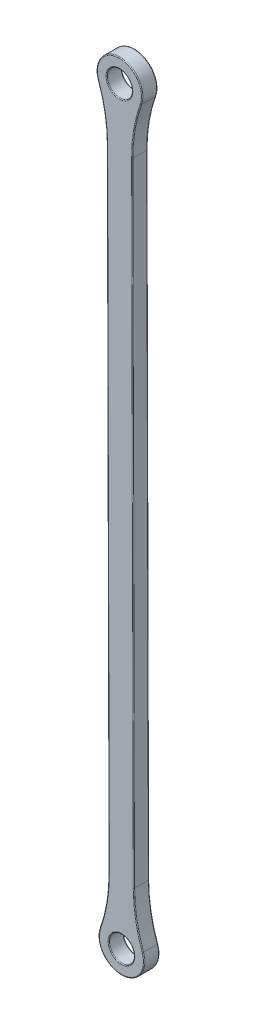
ISO-10303-21;
HEADER;
FILE_DESCRIPTION(('STEP AP214'),'2;1');
FILE_NAME('part.step','',(''),(''),'','','');
FILE_SCHEMA(('AUTOMOTIVE_DESIGN { 1 0 10303 214 1 1 1 1 }'));
ENDSEC;
DATA;
#1=APPLICATION_CONTEXT('core data for automotive mechanical design processes');
#2=APPLICATION_PROTOCOL_DEFINITION('international standard','automotive_design',2000,#1);
#3=PRODUCT_CONTEXT('',#1,'mechanical');
#4=PRODUCT('Part','Part','',(#3));
#5=PRODUCT_RELATED_PRODUCT_CATEGORY('part','',(#4));
#6=PRODUCT_DEFINITION_FORMATION('','',#4);
#7=PRODUCT_DEFINITION_CONTEXT('part definition',#1,'design');
#8=PRODUCT_DEFINITION('design','',#6,#7);
#9=PRODUCT_DEFINITION_SHAPE('','',#8);
#10=(LENGTH_UNIT() NAMED_UNIT(*) SI_UNIT(.MILLI.,.METRE.));
#11=(NAMED_UNIT(*) PLANE_ANGLE_UNIT() SI_UNIT($,.RADIAN.));
#12=(NAMED_UNIT(*) SI_UNIT($,.STERADIAN.) SOLID_ANGLE_UNIT());
#13=UNCERTAINTY_MEASURE_WITH_UNIT(LENGTH_MEASURE(1.E-05),#10,'distance_accuracy_value','');
#14=(GEOMETRIC_REPRESENTATION_CONTEXT(3) GLOBAL_UNCERTAINTY_ASSIGNED_CONTEXT((#13)) GLOBAL_UNIT_ASSIGNED_CONTEXT((#10,
#11,#12)) REPRESENTATION_CONTEXT('',''));
#15=CARTESIAN_POINT('',(0.,0.,0.));
#16=DIRECTION('',(0.,0.,1.));
#17=DIRECTION('',(1.,0.,0.));
#18=AXIS2_PLACEMENT_3D('',#15,#16,#17);
#19=CARTESIAN_POINT('',(12.2160366801793,0.0323959398691062,-3.));
#20=DIRECTION('',(0.999996483681336,0.00265190968255857,0.));
#21=DIRECTION('',(-0.00265190968255857,0.999996483681336,0.));
#22=AXIS2_PLACEMENT_3D('',#19,#20,#21);
#23=PLANE('',#22);
#24=DIRECTION('',(0.,0.,1.));
#25=VECTOR('',#24,1.);
#26=CARTESIAN_POINT('',(11.9693107001592,93.0691664134846,-3.));
#27=LINE('',#26,#25);
#28=CARTESIAN_POINT('',(11.9693107001592,93.0691664134846,-2.85));
#29=VERTEX_POINT('',#28);
#30=CARTESIAN_POINT('',(11.9693107001592,93.0691664134846,-0.15));
#31=VERTEX_POINT('',#30);
#32=EDGE_CURVE('E307',#29,#31,#27,.T.);
#33=ORIENTED_EDGE('',*,*,#32,.T.);
#34=DIRECTION('',(-0.00265190968255857,0.999996483681336,0.));
#35=VECTOR('',#34,1.);
#36=CARTESIAN_POINT('',(11.638224215073,217.917053601405,-0.15));
#37=LINE('',#36,#35);
#38=CARTESIAN_POINT('',(11.638224215073,217.917053601405,-0.15));
#39=VERTEX_POINT('',#38);
#40=EDGE_CURVE('E230',#31,#39,#37,.T.);
#41=ORIENTED_EDGE('',*,*,#40,.T.);
#42=DIRECTION('',(0.,0.,1.));
#43=VECTOR('',#42,1.);
#44=CARTESIAN_POINT('',(11.638224215073,217.917053601405,-3.));
#45=LINE('',#44,#43);
#46=CARTESIAN_POINT('',(11.638224215073,217.917053601405,-2.85));
#47=VERTEX_POINT('',#46);
#48=EDGE_CURVE('E302',#39,#47,#45,.F.);
#49=ORIENTED_EDGE('',*,*,#48,.T.);
#50=DIRECTION('',(-0.00265190968255857,0.999996483681336,0.));
#51=VECTOR('',#50,1.);
#52=CARTESIAN_POINT('',(12.2160366801793,0.0323959398691062,-2.85));
#53=LINE('',#52,#51);
#54=EDGE_CURVE('E228',#47,#29,#53,.F.);
#55=ORIENTED_EDGE('',*,*,#54,.T.);
#56=EDGE_LOOP('',(#33,#41,#49,#55));
#57=FACE_BOUND('',#56,.T.);
#58=ADVANCED_FACE('F36',(#57),#23,.F.);
#59=CARTESIAN_POINT('',(14.1075173503101,229.49947957407,-3.));
#60=DIRECTION('',(0.,0.,1.));
#61=DIRECTION('',(1.,0.,0.));
#62=AXIS2_PLACEMENT_3D('',#59,#60,#61);
#63=CYLINDRICAL_SURFACE('',#62,4.50000000000001);
#64=DIRECTION('',(0.,0.,1.));
#65=VECTOR('',#64,1.);
#66=CARTESIAN_POINT('',(9.87240591826523,227.978351322356,-3.));
#67=LINE('',#66,#65);
#68=CARTESIAN_POINT('',(9.87240591826523,227.978351322356,-2.85));
#69=VERTEX_POINT('',#68);
#70=CARTESIAN_POINT('',(9.87240591826523,227.978351322356,-0.15));
#71=VERTEX_POINT('',#70);
#72=EDGE_CURVE('E171',#69,#71,#67,.T.);
#73=ORIENTED_EDGE('',*,*,#72,.T.);
#74=CARTESIAN_POINT('',(14.1075173503101,229.49947957407,-0.15));
#75=DIRECTION('',(0.,0.,1.));
#76=DIRECTION('',(1.,0.,0.));
#77=AXIS2_PLACEMENT_3D('',#74,#75,#76);
#78=CIRCLE('',#77,4.50000000000001);
#79=CARTESIAN_POINT('',(18.3506369755635,228.000834904447,-0.15));
#80=VERTEX_POINT('',#79);
#81=EDGE_CURVE('E205',#71,#80,#78,.F.);
#82=ORIENTED_EDGE('',*,*,#81,.T.);
#83=DIRECTION('',(0.,0.,1.));
#84=VECTOR('',#83,1.);
#85=CARTESIAN_POINT('',(18.3506369755635,228.000834904447,-3.));
#86=LINE('',#85,#84);
#87=CARTESIAN_POINT('',(18.3506369755635,228.000834904447,-2.85));
#88=VERTEX_POINT('',#87);
#89=EDGE_CURVE('E310',#80,#88,#86,.F.);
#90=ORIENTED_EDGE('',*,*,#89,.T.);
#91=CARTESIAN_POINT('',(14.1075173503101,229.49947957407,-2.85));
#92=DIRECTION('',(0.,0.,1.));
#93=DIRECTION('',(1.,0.,0.));
#94=AXIS2_PLACEMENT_3D('',#91,#92,#93);
#95=CIRCLE('',#94,4.50000000000001);
#96=EDGE_CURVE('E203',#88,#69,#95,.T.);
#97=ORIENTED_EDGE('',*,*,#96,.T.);
#98=EDGE_LOOP('',(#73,#82,#90,#97));
#99=FACE_BOUND('',#98,.T.);
#100=ADVANCED_FACE('F338',(#99),#63,.T.);
#101=CARTESIAN_POINT('',(17.216019098586,0.0456554882818991,-3.));
#102=DIRECTION('',(0.999996483681336,0.00265190968255857,0.));
#103=DIRECTION('',(-0.00265190968255857,0.999996483681336,0.));
#104=AXIS2_PLACEMENT_3D('',#101,#102,#103);
#105=PLANE('',#104);
#106=DIRECTION('',(0.,0.,-1.));
#107=VECTOR('',#106,1.);
#108=CARTESIAN_POINT('',(16.6382066334797,217.930313149817,0.));
#109=LINE('',#108,#107);
#110=CARTESIAN_POINT('',(16.6382066334797,217.930313149817,-2.85));
#111=VERTEX_POINT('',#110);
#112=CARTESIAN_POINT('',(16.6382066334797,217.930313149817,-0.15));
#113=VERTEX_POINT('',#112);
#114=EDGE_CURVE('E313',#111,#113,#109,.F.);
#115=ORIENTED_EDGE('',*,*,#114,.T.);
#116=DIRECTION('',(-0.00265190968255857,0.999996483681336,0.));
#117=VECTOR('',#116,1.);
#118=CARTESIAN_POINT('',(17.216019098586,0.0456554882818991,-0.15));
#119=LINE('',#118,#117);
#120=CARTESIAN_POINT('',(16.9692931185659,93.0824259618973,-0.15));
#121=VERTEX_POINT('',#120);
#122=EDGE_CURVE('E213',#113,#121,#119,.F.);
#123=ORIENTED_EDGE('',*,*,#122,.T.);
#124=DIRECTION('',(0.,0.,-1.));
#125=VECTOR('',#124,1.);
#126=CARTESIAN_POINT('',(16.9692931185659,93.0824259618973,-3.));
#127=LINE('',#126,#125);
#128=CARTESIAN_POINT('',(16.9692931185659,93.0824259618973,-2.85));
#129=VERTEX_POINT('',#128);
#130=EDGE_CURVE('E308',#121,#129,#127,.T.);
#131=ORIENTED_EDGE('',*,*,#130,.T.);
#132=DIRECTION('',(-0.00265190968255857,0.999996483681336,0.));
#133=VECTOR('',#132,1.);
#134=CARTESIAN_POINT('',(16.6382066334797,217.930313149817,-2.85));
#135=LINE('',#134,#133);
#136=EDGE_CURVE('E211',#129,#111,#135,.T.);
#137=ORIENTED_EDGE('',*,*,#136,.T.);
#138=EDGE_LOOP('',(#115,#123,#131,#137));
#139=FACE_BOUND('',#138,.T.);
#140=ADVANCED_FACE('F381',(#139),#105,.T.);
#141=CARTESIAN_POINT('',(14.1075173503101,229.49947957407,-3.));
#142=DIRECTION('',(0.,0.,1.));
#143=DIRECTION('',(1.,0.,0.));
#144=AXIS2_PLACEMENT_3D('',#141,#142,#143);
#145=CYLINDRICAL_SURFACE('',#144,2.50000000000001);
#146=CARTESIAN_POINT('',(14.1075173503101,229.49947957407,-0.15));
#147=DIRECTION('',(0.,0.,1.));
#148=DIRECTION('',(1.,0.,0.));
#149=AXIS2_PLACEMENT_3D('',#146,#147,#148);
#150=CIRCLE('',#149,2.50000000000001);
#151=CARTESIAN_POINT('',(16.6075173503101,229.49947957407,-0.15));
#152=VERTEX_POINT('',#151);
#153=EDGE_CURVE('E197',#152,#152,#150,.T.);
#154=ORIENTED_EDGE('',*,*,#153,.T.);
#155=EDGE_LOOP('',(#154));
#156=FACE_BOUND('',#155,.T.);
#157=CARTESIAN_POINT('',(14.1075173503101,229.49947957407,-2.85));
#158=DIRECTION('',(0.,0.,1.));
#159=DIRECTION('',(1.,0.,0.));
#160=AXIS2_PLACEMENT_3D('',#157,#158,#159);
#161=CIRCLE('',#160,2.50000000000001);
#162=CARTESIAN_POINT('',(16.6075173503101,229.49947957407,-2.85));
#163=VERTEX_POINT('',#162);
#164=EDGE_CURVE('E194',#163,#163,#161,.F.);
#165=ORIENTED_EDGE('',*,*,#164,.T.);
#166=EDGE_LOOP('',(#165));
#167=FACE_BOUND('',#166,.T.);
#168=ADVANCED_FACE('F628',(#156,#167),#145,.F.);
#169=CARTESIAN_POINT('',(14.4999999833287,81.4999999892321,-3.));
#170=DIRECTION('',(0.,0.,1.));
#171=DIRECTION('',(1.,0.,0.));
#172=AXIS2_PLACEMENT_3D('',#169,#170,#171);
#173=CYLINDRICAL_SURFACE('',#172,4.5);
#174=DIRECTION('',(0.,0.,1.));
#175=VECTOR('',#174,1.);
#176=CARTESIAN_POINT('',(18.7351114153736,83.0211282409463,-3.));
#177=LINE('',#176,#175);
#178=CARTESIAN_POINT('',(18.7351114153736,83.0211282409463,-2.85));
#179=VERTEX_POINT('',#178);
#180=CARTESIAN_POINT('',(18.7351114153736,83.0211282409463,-0.15));
#181=VERTEX_POINT('',#180);
#182=EDGE_CURVE('E370',#179,#181,#177,.T.);
#183=ORIENTED_EDGE('',*,*,#182,.T.);
#184=CARTESIAN_POINT('',(14.4999999833287,81.4999999892321,-0.15));
#185=DIRECTION('',(0.,0.,1.));
#186=DIRECTION('',(1.,0.,0.));
#187=AXIS2_PLACEMENT_3D('',#184,#185,#186);
#188=CIRCLE('',#187,4.5);
#189=CARTESIAN_POINT('',(10.2568803580753,82.9986446588551,-0.15));
#190=VERTEX_POINT('',#189);
#191=EDGE_CURVE('E222',#181,#190,#188,.F.);
#192=ORIENTED_EDGE('',*,*,#191,.T.);
#193=DIRECTION('',(0.,0.,1.));
#194=VECTOR('',#193,1.);
#195=CARTESIAN_POINT('',(10.2568803580753,82.9986446588551,-3.));
#196=LINE('',#195,#194);
#197=CARTESIAN_POINT('',(10.2568803580753,82.9986446588551,-2.85));
#198=VERTEX_POINT('',#197);
#199=EDGE_CURVE('E265',#190,#198,#196,.F.);
#200=ORIENTED_EDGE('',*,*,#199,.T.);
#201=CARTESIAN_POINT('',(14.4999999833287,81.4999999892321,-2.85));
#202=DIRECTION('',(0.,0.,1.));
#203=DIRECTION('',(1.,0.,0.));
#204=AXIS2_PLACEMENT_3D('',#201,#202,#203);
#205=CIRCLE('',#204,4.5);
#206=EDGE_CURVE('E220',#198,#179,#205,.T.);
#207=ORIENTED_EDGE('',*,*,#206,.T.);
#208=EDGE_LOOP('',(#183,#192,#200,#207));
#209=FACE_BOUND('',#208,.T.);
#210=ADVANCED_FACE('F369',(#209),#173,.T.);
#211=CARTESIAN_POINT('',(14.4999999833287,81.4999999892321,-3.));
#212=DIRECTION('',(0.,0.,1.));
#213=DIRECTION('',(1.,0.,0.));
#214=AXIS2_PLACEMENT_3D('',#211,#212,#213);
#215=CYLINDRICAL_SURFACE('',#214,2.50000000000001);
#216=CARTESIAN_POINT('',(14.4999999833287,81.4999999892321,-0.15));
#217=DIRECTION('',(0.,0.,1.));
#218=DIRECTION('',(1.,0.,0.));
#219=AXIS2_PLACEMENT_3D('',#216,#217,#218);
#220=CIRCLE('',#219,2.50000000000001);
#221=CARTESIAN_POINT('',(16.9999999833288,81.4999999892321,-0.15));
#222=VERTEX_POINT('',#221);
#223=EDGE_CURVE('E191',#222,#222,#220,.T.);
#224=ORIENTED_EDGE('',*,*,#223,.T.);
#225=EDGE_LOOP('',(#224));
#226=FACE_BOUND('',#225,.T.);
#227=CARTESIAN_POINT('',(14.4999999833287,81.4999999892321,-2.85));
#228=DIRECTION('',(0.,0.,1.));
#229=DIRECTION('',(1.,0.,0.));
#230=AXIS2_PLACEMENT_3D('',#227,#228,#229);
#231=CIRCLE('',#230,2.50000000000001);
#232=CARTESIAN_POINT('',(16.9999999833288,81.4999999892321,-2.85));
#233=VERTEX_POINT('',#232);
#234=EDGE_CURVE('E188',#233,#233,#231,.F.);
#235=ORIENTED_EDGE('',*,*,#234,.T.);
#236=EDGE_LOOP('',(#235));
#237=FACE_BOUND('',#236,.T.);
#238=ADVANCED_FACE('F605',(#226,#237),#215,.F.);
#239=CARTESIAN_POINT('',(0.,0.,-3.));
#240=DIRECTION('',(0.,0.,1.));
#241=DIRECTION('',(1.,0.,0.));
#242=AXIS2_PLACEMENT_3D('',#239,#240,#241);
#243=PLANE('',#242);
#244=CARTESIAN_POINT('',(14.4999999833287,81.4999999892321,-3.));
#245=DIRECTION('',(0.,0.,1.));
#246=DIRECTION('',(1.,0.,0.));
#247=AXIS2_PLACEMENT_3D('',#244,#245,#246);
#248=CIRCLE('',#247,2.65000000000001);
#249=CARTESIAN_POINT('',(17.1499999833288,81.4999999892321,-3.));
#250=VERTEX_POINT('',#249);
#251=EDGE_CURVE('E11',#250,#250,#248,.T.);
#252=ORIENTED_EDGE('',*,*,#251,.T.);
#253=EDGE_LOOP('',(#252));
#254=FACE_BOUND('',#253,.T.);
#255=CARTESIAN_POINT('',(14.1075173503101,229.49947957407,-3.));
#256=DIRECTION('',(0.,0.,1.));
#257=DIRECTION('',(1.,0.,0.));
#258=AXIS2_PLACEMENT_3D('',#255,#256,#257);
#259=CIRCLE('',#258,2.65000000000001);
#260=CARTESIAN_POINT('',(16.7575173503101,229.49947957407,-3.));
#261=VERTEX_POINT('',#260);
#262=EDGE_CURVE('E45',#261,#261,#259,.T.);
#263=ORIENTED_EDGE('',*,*,#262,.T.);
#264=EDGE_LOOP('',(#263));
#265=FACE_BOUND('',#264,.T.);
#266=DIRECTION('',(-0.00265190968255857,0.999996483681336,0.));
#267=VECTOR('',#266,1.);
#268=CARTESIAN_POINT('',(16.8192936460137,93.0820281754449,-3.));
#269=LINE('',#268,#267);
#270=CARTESIAN_POINT('',(16.4882071609275,217.929915363365,-3.));
#271=VERTEX_POINT('',#270);
#272=CARTESIAN_POINT('',(16.8192936460137,93.082028175445,-3.));
#273=VERTEX_POINT('',#272);
#274=EDGE_CURVE('E53',#271,#273,#269,.F.);
#275=ORIENTED_EDGE('',*,*,#274,.T.);
#276=CARTESIAN_POINT('',(46.9691876290059,93.1619832523741,-3.));
#277=DIRECTION('',(0.,0.,1.));
#278=DIRECTION('',(1.,0.,0.));
#279=AXIS2_PLACEMENT_3D('',#276,#277,#278);
#280=CIRCLE('',#279,30.15);
#281=CARTESIAN_POINT('',(18.5939410343054,82.9704239658892,-3.));
#282=VERTEX_POINT('',#281);
#283=EDGE_CURVE('E244',#273,#282,#280,.T.);
#284=ORIENTED_EDGE('',*,*,#283,.T.);
#285=CARTESIAN_POINT('',(14.4999999833287,81.4999999892321,-3.));
#286=DIRECTION('',(0.,0.,1.));
#287=DIRECTION('',(1.,0.,0.));
#288=AXIS2_PLACEMENT_3D('',#285,#286,#287);
#289=CIRCLE('',#288,4.35);
#290=CARTESIAN_POINT('',(10.3983176789171,82.9486898365343,-3.));
#291=VERTEX_POINT('',#290);
#292=EDGE_CURVE('E232',#282,#291,#289,.F.);
#293=ORIENTED_EDGE('',*,*,#292,.T.);
#294=CARTESIAN_POINT('',(-18.0305838102809,92.9896091230079,-3.));
#295=DIRECTION('',(0.,0.,1.));
#296=DIRECTION('',(1.,0.,0.));
#297=AXIS2_PLACEMENT_3D('',#294,#295,#296);
#298=CIRCLE('',#297,30.15);
#299=CARTESIAN_POINT('',(12.1193101727114,93.069564199937,-3.));
#300=VERTEX_POINT('',#299);
#301=EDGE_CURVE('E234',#291,#300,#298,.T.);
#302=ORIENTED_EDGE('',*,*,#301,.T.);
#303=DIRECTION('',(-0.00265190968255857,0.999996483681336,0.));
#304=VECTOR('',#303,1.);
#305=CARTESIAN_POINT('',(12.3660361527315,0.03279372632149,-3.));
#306=LINE('',#305,#304);
#307=CARTESIAN_POINT('',(11.7882236876252,217.917451387857,-3.));
#308=VERTEX_POINT('',#307);
#309=EDGE_CURVE('E236',#300,#308,#306,.T.);
#310=ORIENTED_EDGE('',*,*,#309,.T.);
#311=CARTESIAN_POINT('',(-18.3616702953671,217.837496310928,-3.));
#312=DIRECTION('',(0.,0.,1.));
#313=DIRECTION('',(1.,0.,0.));
#314=AXIS2_PLACEMENT_3D('',#311,#312,#313);
#315=CIRCLE('',#314,30.15);
#316=CARTESIAN_POINT('',(10.0135762993334,228.029055597413,-3.));
#317=VERTEX_POINT('',#316);
#318=EDGE_CURVE('E238',#308,#317,#315,.T.);
#319=ORIENTED_EDGE('',*,*,#318,.T.);
#320=CARTESIAN_POINT('',(14.1075173503101,229.49947957407,-3.));
#321=DIRECTION('',(0.,0.,1.));
#322=DIRECTION('',(1.,0.,0.));
#323=AXIS2_PLACEMENT_3D('',#320,#321,#322);
#324=CIRCLE('',#323,4.35000000000001);
#325=CARTESIAN_POINT('',(18.2091996547217,228.050789726768,-3.));
#326=VERTEX_POINT('',#325);
#327=EDGE_CURVE('E240',#317,#326,#324,.F.);
#328=ORIENTED_EDGE('',*,*,#327,.T.);
#329=CARTESIAN_POINT('',(46.6381011439197,218.009870440294,-3.));
#330=DIRECTION('',(0.,0.,1.));
#331=DIRECTION('',(1.,0.,0.));
#332=AXIS2_PLACEMENT_3D('',#329,#330,#331);
#333=CIRCLE('',#332,30.15);
#334=EDGE_CURVE('E58',#326,#271,#333,.T.);
#335=ORIENTED_EDGE('',*,*,#334,.T.);
#336=EDGE_LOOP('',(#275,#284,#293,#302,#310,#319,#328,#335));
#337=FACE_BOUND('',#336,.T.);
#338=ADVANCED_FACE('F355',(#254,#265,#337),#243,.F.);
#339=CARTESIAN_POINT('',(0.,0.,0.));
#340=DIRECTION('',(0.,0.,1.));
#341=DIRECTION('',(1.,0.,0.));
#342=AXIS2_PLACEMENT_3D('',#339,#340,#341);
#343=PLANE('',#342);
#344=CARTESIAN_POINT('',(14.4999999833287,81.4999999892321,0.));
#345=DIRECTION('',(0.,0.,1.));
#346=DIRECTION('',(1.,0.,0.));
#347=AXIS2_PLACEMENT_3D('',#344,#345,#346);
#348=CIRCLE('',#347,2.65000000000001);
#349=CARTESIAN_POINT('',(17.1499999833288,81.4999999892321,0.));
#350=VERTEX_POINT('',#349);
#351=EDGE_CURVE('E180',#350,#350,#348,.F.);
#352=ORIENTED_EDGE('',*,*,#351,.T.);
#353=EDGE_LOOP('',(#352));
#354=FACE_BOUND('',#353,.T.);
#355=CARTESIAN_POINT('',(14.1075173503101,229.49947957407,0.));
#356=DIRECTION('',(0.,0.,1.));
#357=DIRECTION('',(1.,0.,0.));
#358=AXIS2_PLACEMENT_3D('',#355,#356,#357);
#359=CIRCLE('',#358,2.65000000000001);
#360=CARTESIAN_POINT('',(16.7575173503101,229.49947957407,0.));
#361=VERTEX_POINT('',#360);
#362=EDGE_CURVE('E177',#361,#361,#359,.F.);
#363=ORIENTED_EDGE('',*,*,#362,.T.);
#364=EDGE_LOOP('',(#363));
#365=FACE_BOUND('',#364,.T.);
#366=CARTESIAN_POINT('',(14.1075173503101,229.49947957407,0.));
#367=DIRECTION('',(0.,0.,1.));
#368=DIRECTION('',(1.,0.,0.));
#369=AXIS2_PLACEMENT_3D('',#366,#367,#368);
#370=CIRCLE('',#369,4.35000000000001);
#371=CARTESIAN_POINT('',(18.2091996547217,228.050789726768,0.));
#372=VERTEX_POINT('',#371);
#373=CARTESIAN_POINT('',(10.0135762993334,228.029055597413,0.));
#374=VERTEX_POINT('',#373);
#375=EDGE_CURVE('E175',#372,#374,#370,.T.);
#376=ORIENTED_EDGE('',*,*,#375,.T.);
#377=CARTESIAN_POINT('',(-18.3616702953671,217.837496310928,0.));
#378=DIRECTION('',(0.,0.,1.));
#379=DIRECTION('',(1.,0.,0.));
#380=AXIS2_PLACEMENT_3D('',#377,#378,#379);
#381=CIRCLE('',#380,30.15);
#382=CARTESIAN_POINT('',(11.7882236876252,217.917451387857,0.));
#383=VERTEX_POINT('',#382);
#384=EDGE_CURVE('E156',#374,#383,#381,.F.);
#385=ORIENTED_EDGE('',*,*,#384,.T.);
#386=DIRECTION('',(-0.00265190968255857,0.999996483681336,0.));
#387=VECTOR('',#386,1.);
#388=CARTESIAN_POINT('',(12.1193101727114,93.069564199937,0.));
#389=LINE('',#388,#387);
#390=CARTESIAN_POINT('',(12.1193101727114,93.069564199937,0.));
#391=VERTEX_POINT('',#390);
#392=EDGE_CURVE('E164',#383,#391,#389,.F.);
#393=ORIENTED_EDGE('',*,*,#392,.T.);
#394=CARTESIAN_POINT('',(-18.0305838102809,92.9896091230079,0.));
#395=DIRECTION('',(0.,0.,1.));
#396=DIRECTION('',(1.,0.,0.));
#397=AXIS2_PLACEMENT_3D('',#394,#395,#396);
#398=CIRCLE('',#397,30.15);
#399=CARTESIAN_POINT('',(10.3983176789171,82.9486898365343,0.));
#400=VERTEX_POINT('',#399);
#401=EDGE_CURVE('E170',#391,#400,#398,.F.);
#402=ORIENTED_EDGE('',*,*,#401,.T.);
#403=CARTESIAN_POINT('',(14.4999999833287,81.4999999892321,0.));
#404=DIRECTION('',(0.,0.,1.));
#405=DIRECTION('',(1.,0.,0.));
#406=AXIS2_PLACEMENT_3D('',#403,#404,#405);
#407=CIRCLE('',#406,4.35);
#408=CARTESIAN_POINT('',(18.5939410343054,82.9704239658892,0.));
#409=VERTEX_POINT('',#408);
#410=EDGE_CURVE('E321',#400,#409,#407,.T.);
#411=ORIENTED_EDGE('',*,*,#410,.T.);
#412=CARTESIAN_POINT('',(46.9691876290059,93.1619832523741,0.));
#413=DIRECTION('',(0.,0.,1.));
#414=DIRECTION('',(1.,0.,0.));
#415=AXIS2_PLACEMENT_3D('',#412,#413,#414);
#416=CIRCLE('',#415,30.15);
#417=CARTESIAN_POINT('',(16.8192936460137,93.082028175445,0.));
#418=VERTEX_POINT('',#417);
#419=EDGE_CURVE('E323',#409,#418,#416,.F.);
#420=ORIENTED_EDGE('',*,*,#419,.T.);
#421=DIRECTION('',(-0.00265190968255857,0.999996483681336,0.));
#422=VECTOR('',#421,1.);
#423=CARTESIAN_POINT('',(17.0660196260338,0.0452577018295153,0.));
#424=LINE('',#423,#422);
#425=CARTESIAN_POINT('',(16.4882071609275,217.929915363365,0.));
#426=VERTEX_POINT('',#425);
#427=EDGE_CURVE('E325',#418,#426,#424,.T.);
#428=ORIENTED_EDGE('',*,*,#427,.T.);
#429=CARTESIAN_POINT('',(46.6381011439197,218.009870440294,0.));
#430=DIRECTION('',(0.,0.,1.));
#431=DIRECTION('',(1.,0.,0.));
#432=AXIS2_PLACEMENT_3D('',#429,#430,#431);
#433=CIRCLE('',#432,30.15);
#434=EDGE_CURVE('E182',#426,#372,#433,.F.);
#435=ORIENTED_EDGE('',*,*,#434,.T.);
#436=EDGE_LOOP('',(#376,#385,#393,#402,#411,#420,#428,#435));
#437=FACE_BOUND('',#436,.T.);
#438=ADVANCED_FACE('F173',(#354,#365,#437),#343,.T.);
#439=CARTESIAN_POINT('',(46.9691876290059,93.1619832523741,-3.));
#440=DIRECTION('',(0.,0.,1.));
#441=DIRECTION('',(1.,0.,0.));
#442=AXIS2_PLACEMENT_3D('',#439,#440,#441);
#443=CYLINDRICAL_SURFACE('',#442,30.);
#444=ORIENTED_EDGE('',*,*,#130,.F.);
#445=CARTESIAN_POINT('',(46.9691876290059,93.1619832523741,-0.15));
#446=DIRECTION('',(0.,0.,1.));
#447=DIRECTION('',(1.,0.,0.));
#448=AXIS2_PLACEMENT_3D('',#445,#446,#447);
#449=CIRCLE('',#448,30.);
#450=EDGE_CURVE('E218',#121,#181,#449,.T.);
#451=ORIENTED_EDGE('',*,*,#450,.T.);
#452=ORIENTED_EDGE('',*,*,#182,.F.);
#453=CARTESIAN_POINT('',(46.9691876290059,93.1619832523741,-2.85));
#454=DIRECTION('',(0.,0.,1.));
#455=DIRECTION('',(1.,0.,0.));
#456=AXIS2_PLACEMENT_3D('',#453,#454,#455);
#457=CIRCLE('',#456,30.);
#458=EDGE_CURVE('E215',#179,#129,#457,.F.);
#459=ORIENTED_EDGE('',*,*,#458,.T.);
#460=EDGE_LOOP('',(#444,#451,#452,#459));
#461=FACE_BOUND('',#460,.T.);
#462=ADVANCED_FACE('F375',(#461),#443,.F.);
#463=CARTESIAN_POINT('',(-18.0305838102809,92.9896091230079,-3.));
#464=DIRECTION('',(0.,0.,1.));
#465=DIRECTION('',(1.,0.,0.));
#466=AXIS2_PLACEMENT_3D('',#463,#464,#465);
#467=CYLINDRICAL_SURFACE('',#466,30.);
#468=ORIENTED_EDGE('',*,*,#199,.F.);
#469=CARTESIAN_POINT('',(-18.0305838102809,92.9896091230079,-0.15));
#470=DIRECTION('',(0.,0.,1.));
#471=DIRECTION('',(1.,0.,0.));
#472=AXIS2_PLACEMENT_3D('',#469,#470,#471);
#473=CIRCLE('',#472,30.);
#474=EDGE_CURVE('E226',#190,#31,#473,.T.);
#475=ORIENTED_EDGE('',*,*,#474,.T.);
#476=ORIENTED_EDGE('',*,*,#32,.F.);
#477=CARTESIAN_POINT('',(-18.0305838102809,92.9896091230079,-2.85));
#478=DIRECTION('',(0.,0.,1.));
#479=DIRECTION('',(1.,0.,0.));
#480=AXIS2_PLACEMENT_3D('',#477,#478,#479);
#481=CIRCLE('',#480,30.);
#482=EDGE_CURVE('E224',#29,#198,#481,.F.);
#483=ORIENTED_EDGE('',*,*,#482,.T.);
#484=EDGE_LOOP('',(#468,#475,#476,#483));
#485=FACE_BOUND('',#484,.T.);
#486=ADVANCED_FACE('F395',(#485),#467,.F.);
#487=CARTESIAN_POINT('',(-18.3616702953671,217.837496310928,-3.));
#488=DIRECTION('',(0.,0.,1.));
#489=DIRECTION('',(1.,0.,0.));
#490=AXIS2_PLACEMENT_3D('',#487,#488,#489);
#491=CYLINDRICAL_SURFACE('',#490,30.);
#492=ORIENTED_EDGE('',*,*,#48,.F.);
#493=CARTESIAN_POINT('',(-18.3616702953671,217.837496310928,-0.15));
#494=DIRECTION('',(0.,0.,1.));
#495=DIRECTION('',(1.,0.,0.));
#496=AXIS2_PLACEMENT_3D('',#493,#494,#495);
#497=CIRCLE('',#496,30.);
#498=EDGE_CURVE('E158',#39,#71,#497,.T.);
#499=ORIENTED_EDGE('',*,*,#498,.T.);
#500=ORIENTED_EDGE('',*,*,#72,.F.);
#501=CARTESIAN_POINT('',(-18.3616702953671,217.837496310928,-2.85));
#502=DIRECTION('',(0.,0.,1.));
#503=DIRECTION('',(1.,0.,0.));
#504=AXIS2_PLACEMENT_3D('',#501,#502,#503);
#505=CIRCLE('',#504,30.);
#506=EDGE_CURVE('E200',#69,#47,#505,.F.);
#507=ORIENTED_EDGE('',*,*,#506,.T.);
#508=EDGE_LOOP('',(#492,#499,#500,#507));
#509=FACE_BOUND('',#508,.T.);
#510=ADVANCED_FACE('F301',(#509),#491,.F.);
#511=CARTESIAN_POINT('',(46.6381011439197,218.009870440294,-3.));
#512=DIRECTION('',(0.,0.,1.));
#513=DIRECTION('',(1.,0.,0.));
#514=AXIS2_PLACEMENT_3D('',#511,#512,#513);
#515=CYLINDRICAL_SURFACE('',#514,30.);
#516=ORIENTED_EDGE('',*,*,#89,.F.);
#517=CARTESIAN_POINT('',(46.6381011439197,218.009870440294,-0.15));
#518=DIRECTION('',(0.,0.,1.));
#519=DIRECTION('',(1.,0.,0.));
#520=AXIS2_PLACEMENT_3D('',#517,#518,#519);
#521=CIRCLE('',#520,30.);
#522=EDGE_CURVE('E209',#80,#113,#521,.T.);
#523=ORIENTED_EDGE('',*,*,#522,.T.);
#524=ORIENTED_EDGE('',*,*,#114,.F.);
#525=CARTESIAN_POINT('',(46.6381011439197,218.009870440294,-2.85));
#526=DIRECTION('',(0.,0.,1.));
#527=DIRECTION('',(1.,0.,0.));
#528=AXIS2_PLACEMENT_3D('',#525,#526,#527);
#529=CIRCLE('',#528,30.);
#530=EDGE_CURVE('E207',#111,#88,#529,.F.);
#531=ORIENTED_EDGE('',*,*,#530,.T.);
#532=EDGE_LOOP('',(#516,#523,#524,#531));
#533=FACE_BOUND('',#532,.T.);
#534=ADVANCED_FACE('F340',(#533),#515,.F.);
#535=CARTESIAN_POINT('',(14.4999999833287,81.4999999892321,-0.15));
#536=DIRECTION('',(0.,0.,1.));
#537=DIRECTION('',(1.,0.,0.));
#538=AXIS2_PLACEMENT_3D('',#535,#536,#537);
#539=TOROIDAL_SURFACE('',#538,2.65000000000001,0.15);
#540=ORIENTED_EDGE('',*,*,#223,.F.);
#541=EDGE_LOOP('',(#540));
#542=FACE_BOUND('',#541,.T.);
#543=ORIENTED_EDGE('',*,*,#351,.F.);
#544=EDGE_LOOP('',(#543));
#545=FACE_BOUND('',#544,.T.);
#546=ADVANCED_FACE('F421',(#542,#545),#539,.T.);
#547=CARTESIAN_POINT('',(14.1075173503101,229.49947957407,-0.15));
#548=DIRECTION('',(0.,0.,1.));
#549=DIRECTION('',(1.,0.,0.));
#550=AXIS2_PLACEMENT_3D('',#547,#548,#549);
#551=TOROIDAL_SURFACE('',#550,2.65000000000001,0.15);
#552=ORIENTED_EDGE('',*,*,#362,.F.);
#553=EDGE_LOOP('',(#552));
#554=FACE_BOUND('',#553,.T.);
#555=ORIENTED_EDGE('',*,*,#153,.F.);
#556=EDGE_LOOP('',(#555));
#557=FACE_BOUND('',#556,.T.);
#558=ADVANCED_FACE('F424',(#554,#557),#551,.T.);
#559=CARTESIAN_POINT('',(46.9691876290059,93.1619832523741,-0.15));
#560=DIRECTION('',(0.,0.,1.));
#561=DIRECTION('',(1.,0.,0.));
#562=AXIS2_PLACEMENT_3D('',#559,#560,#561);
#563=TOROIDAL_SURFACE('',#562,30.15,0.15);
#564=CARTESIAN_POINT('',(18.5939410343054,82.9704239658892,-0.15));
#565=DIRECTION('',(0.338028500380945,-0.941135873787738,0.));
#566=DIRECTION('',(0.941135873787738,0.338028500380945,0.));
#567=AXIS2_PLACEMENT_3D('',#564,#565,#566);
#568=CIRCLE('',#567,0.15);
#569=EDGE_CURVE('E259',#181,#409,#568,.T.);
#570=ORIENTED_EDGE('',*,*,#569,.F.);
#571=ORIENTED_EDGE('',*,*,#450,.F.);
#572=CARTESIAN_POINT('',(16.8192936460137,93.082028175445,-0.15));
#573=DIRECTION('',(-0.00265190968259018,0.999996483681335,0.));
#574=DIRECTION('',(-0.999996483681336,-0.00265190968259018,0.));
#575=AXIS2_PLACEMENT_3D('',#572,#573,#574);
#576=CIRCLE('',#575,0.15);
#577=EDGE_CURVE('E262',#418,#121,#576,.T.);
#578=ORIENTED_EDGE('',*,*,#577,.F.);
#579=ORIENTED_EDGE('',*,*,#419,.F.);
#580=EDGE_LOOP('',(#570,#571,#578,#579));
#581=FACE_BOUND('',#580,.T.);
#582=ADVANCED_FACE('F387',(#581),#563,.T.);
#583=CARTESIAN_POINT('',(17.0660196260338,0.0452577018295153,-0.15));
#584=DIRECTION('',(-0.00265190968255857,0.999996483681336,0.));
#585=DIRECTION('',(-0.999996483681336,-0.00265190968255857,0.));
#586=AXIS2_PLACEMENT_3D('',#583,#584,#585);
#587=CYLINDRICAL_SURFACE('',#586,0.15);
#588=ORIENTED_EDGE('',*,*,#577,.T.);
#589=ORIENTED_EDGE('',*,*,#122,.F.);
#590=CARTESIAN_POINT('',(16.4882071609275,217.929915363365,-0.15));
#591=DIRECTION('',(-0.00265190968259018,0.999996483681335,0.));
#592=DIRECTION('',(-0.999996483681336,-0.00265190968259018,0.));
#593=AXIS2_PLACEMENT_3D('',#590,#591,#592);
#594=CIRCLE('',#593,0.15);
#595=EDGE_CURVE('E256',#426,#113,#594,.T.);
#596=ORIENTED_EDGE('',*,*,#595,.F.);
#597=ORIENTED_EDGE('',*,*,#427,.F.);
#598=EDGE_LOOP('',(#588,#589,#596,#597));
#599=FACE_BOUND('',#598,.T.);
#600=ADVANCED_FACE('F383',(#599),#587,.T.);
#601=CARTESIAN_POINT('',(14.4999999833287,81.4999999892321,-0.15));
#602=DIRECTION('',(0.,0.,1.));
#603=DIRECTION('',(1.,0.,0.));
#604=AXIS2_PLACEMENT_3D('',#601,#602,#603);
#605=TOROIDAL_SURFACE('',#604,4.35,0.15);
#606=ORIENTED_EDGE('',*,*,#569,.T.);
#607=ORIENTED_EDGE('',*,*,#410,.F.);
#608=CARTESIAN_POINT('',(10.3983176789171,82.9486898365343,-0.15));
#609=DIRECTION('',(0.333032148805057,0.942915472278553,0.));
#610=DIRECTION('',(-0.942915472278553,0.333032148805057,0.));
#611=AXIS2_PLACEMENT_3D('',#608,#609,#610);
#612=CIRCLE('',#611,0.15);
#613=EDGE_CURVE('E253',#190,#400,#612,.T.);
#614=ORIENTED_EDGE('',*,*,#613,.F.);
#615=ORIENTED_EDGE('',*,*,#191,.F.);
#616=EDGE_LOOP('',(#606,#607,#614,#615));
#617=FACE_BOUND('',#616,.T.);
#618=ADVANCED_FACE('F392',(#617),#605,.T.);
#619=CARTESIAN_POINT('',(46.6381011439197,218.009870440294,-0.15));
#620=DIRECTION('',(0.,0.,1.));
#621=DIRECTION('',(1.,0.,0.));
#622=AXIS2_PLACEMENT_3D('',#619,#620,#621);
#623=TOROIDAL_SURFACE('',#622,30.15,0.15);
#624=ORIENTED_EDGE('',*,*,#595,.T.);
#625=ORIENTED_EDGE('',*,*,#522,.F.);
#626=CARTESIAN_POINT('',(18.2091996547217,228.050789726768,-0.15));
#627=DIRECTION('',(0.33303214880505,0.942915472278555,0.));
#628=DIRECTION('',(-0.942915472278556,0.33303214880505,0.));
#629=AXIS2_PLACEMENT_3D('',#626,#627,#628);
#630=CIRCLE('',#629,0.15);
#631=EDGE_CURVE('E250',#372,#80,#630,.T.);
#632=ORIENTED_EDGE('',*,*,#631,.F.);
#633=ORIENTED_EDGE('',*,*,#434,.F.);
#634=EDGE_LOOP('',(#624,#625,#632,#633));
#635=FACE_BOUND('',#634,.T.);
#636=ADVANCED_FACE('F332',(#635),#623,.T.);
#637=CARTESIAN_POINT('',(-18.0305838102809,92.9896091230079,-0.15));
#638=DIRECTION('',(0.,0.,1.));
#639=DIRECTION('',(1.,0.,0.));
#640=AXIS2_PLACEMENT_3D('',#637,#638,#639);
#641=TOROIDAL_SURFACE('',#640,30.15,0.15);
#642=ORIENTED_EDGE('',*,*,#613,.T.);
#643=ORIENTED_EDGE('',*,*,#401,.F.);
#644=CARTESIAN_POINT('',(12.1193101727114,93.069564199937,-0.15));
#645=DIRECTION('',(-0.00265190968259018,0.999996483681335,0.));
#646=DIRECTION('',(-0.999996483681336,-0.00265190968259018,0.));
#647=AXIS2_PLACEMENT_3D('',#644,#645,#646);
#648=CIRCLE('',#647,0.15);
#649=EDGE_CURVE('E167',#31,#391,#648,.T.);
#650=ORIENTED_EDGE('',*,*,#649,.F.);
#651=ORIENTED_EDGE('',*,*,#474,.F.);
#652=EDGE_LOOP('',(#642,#643,#650,#651));
#653=FACE_BOUND('',#652,.T.);
#654=ADVANCED_FACE('F436',(#653),#641,.T.);
#655=CARTESIAN_POINT('',(14.1075173503101,229.49947957407,-0.15));
#656=DIRECTION('',(0.,0.,1.));
#657=DIRECTION('',(1.,0.,0.));
#658=AXIS2_PLACEMENT_3D('',#655,#656,#657);
#659=TOROIDAL_SURFACE('',#658,4.35000000000001,0.15);
#660=ORIENTED_EDGE('',*,*,#631,.T.);
#661=ORIENTED_EDGE('',*,*,#81,.F.);
#662=CARTESIAN_POINT('',(10.0135762993334,228.029055597413,-0.15));
#663=DIRECTION('',(0.338028500380855,-0.941135873787771,0.));
#664=DIRECTION('',(0.941135873787771,0.338028500380855,0.));
#665=AXIS2_PLACEMENT_3D('',#662,#663,#664);
#666=CIRCLE('',#665,0.15);
#667=EDGE_CURVE('E161',#374,#71,#666,.T.);
#668=ORIENTED_EDGE('',*,*,#667,.F.);
#669=ORIENTED_EDGE('',*,*,#375,.F.);
#670=EDGE_LOOP('',(#660,#661,#668,#669));
#671=FACE_BOUND('',#670,.T.);
#672=ADVANCED_FACE('F335',(#671),#659,.T.);
#673=CARTESIAN_POINT('',(12.3660361527315,0.03279372632149,-0.15));
#674=DIRECTION('',(0.00265190968255857,-0.999996483681336,0.));
#675=DIRECTION('',(0.999996483681336,0.00265190968255857,0.));
#676=AXIS2_PLACEMENT_3D('',#673,#674,#675);
#677=CYLINDRICAL_SURFACE('',#676,0.15);
#678=ORIENTED_EDGE('',*,*,#649,.T.);
#679=ORIENTED_EDGE('',*,*,#392,.F.);
#680=CARTESIAN_POINT('',(11.7882236876252,217.917451387857,-0.15));
#681=DIRECTION('',(-0.00265190968259018,0.999996483681335,0.));
#682=DIRECTION('',(-0.999996483681336,-0.00265190968259018,0.));
#683=AXIS2_PLACEMENT_3D('',#680,#681,#682);
#684=CIRCLE('',#683,0.15);
#685=EDGE_CURVE('E152',#39,#383,#684,.T.);
#686=ORIENTED_EDGE('',*,*,#685,.F.);
#687=ORIENTED_EDGE('',*,*,#40,.F.);
#688=EDGE_LOOP('',(#678,#679,#686,#687));
#689=FACE_BOUND('',#688,.T.);
#690=ADVANCED_FACE('F165',(#689),#677,.T.);
#691=CARTESIAN_POINT('',(-18.3616702953671,217.837496310928,-0.15));
#692=DIRECTION('',(0.,0.,1.));
#693=DIRECTION('',(1.,0.,0.));
#694=AXIS2_PLACEMENT_3D('',#691,#692,#693);
#695=TOROIDAL_SURFACE('',#694,30.15,0.15);
#696=ORIENTED_EDGE('',*,*,#667,.T.);
#697=ORIENTED_EDGE('',*,*,#498,.F.);
#698=ORIENTED_EDGE('',*,*,#685,.T.);
#699=ORIENTED_EDGE('',*,*,#384,.F.);
#700=EDGE_LOOP('',(#696,#697,#698,#699));
#701=FACE_BOUND('',#700,.T.);
#702=ADVANCED_FACE('F154',(#701),#695,.T.);
#703=CARTESIAN_POINT('',(14.4999999833287,81.4999999892321,-2.85));
#704=DIRECTION('',(0.,0.,1.));
#705=DIRECTION('',(1.,0.,0.));
#706=AXIS2_PLACEMENT_3D('',#703,#704,#705);
#707=TOROIDAL_SURFACE('',#706,2.65000000000001,0.15);
#708=ORIENTED_EDGE('',*,*,#251,.F.);
#709=EDGE_LOOP('',(#708));
#710=FACE_BOUND('',#709,.T.);
#711=ORIENTED_EDGE('',*,*,#234,.F.);
#712=EDGE_LOOP('',(#711));
#713=FACE_BOUND('',#712,.T.);
#714=ADVANCED_FACE('F431',(#710,#713),#707,.T.);
#715=CARTESIAN_POINT('',(14.1075173503101,229.49947957407,-2.85));
#716=DIRECTION('',(0.,0.,1.));
#717=DIRECTION('',(1.,0.,0.));
#718=AXIS2_PLACEMENT_3D('',#715,#716,#717);
#719=TOROIDAL_SURFACE('',#718,2.65000000000001,0.15);
#720=ORIENTED_EDGE('',*,*,#164,.F.);
#721=EDGE_LOOP('',(#720));
#722=FACE_BOUND('',#721,.T.);
#723=ORIENTED_EDGE('',*,*,#262,.F.);
#724=EDGE_LOOP('',(#723));
#725=FACE_BOUND('',#724,.T.);
#726=ADVANCED_FACE('F450',(#722,#725),#719,.T.);
#727=CARTESIAN_POINT('',(-18.3616702953671,217.837496310928,-2.85));
#728=DIRECTION('',(0.,0.,1.));
#729=DIRECTION('',(1.,0.,0.));
#730=AXIS2_PLACEMENT_3D('',#727,#728,#729);
#731=TOROIDAL_SURFACE('',#730,30.15,0.15);
#732=CARTESIAN_POINT('',(11.7882236876252,217.917451387857,-2.85));
#733=DIRECTION('',(0.00265190968259018,-0.999996483681335,0.));
#734=DIRECTION('',(0.999996483681336,0.00265190968259018,0.));
#735=AXIS2_PLACEMENT_3D('',#732,#733,#734);
#736=CIRCLE('',#735,0.15);
#737=EDGE_CURVE('E281',#47,#308,#736,.T.);
#738=ORIENTED_EDGE('',*,*,#737,.F.);
#739=ORIENTED_EDGE('',*,*,#506,.F.);
#740=CARTESIAN_POINT('',(10.0135762993334,228.029055597413,-2.85));
#741=DIRECTION('',(-0.338028500380852,0.941135873787772,0.));
#742=DIRECTION('',(-0.941135873787772,-0.338028500380852,0.));
#743=AXIS2_PLACEMENT_3D('',#740,#741,#742);
#744=CIRCLE('',#743,0.15);
#745=EDGE_CURVE('E40',#317,#69,#744,.T.);
#746=ORIENTED_EDGE('',*,*,#745,.F.);
#747=ORIENTED_EDGE('',*,*,#318,.F.);
#748=EDGE_LOOP('',(#738,#739,#746,#747));
#749=FACE_BOUND('',#748,.T.);
#750=ADVANCED_FACE('F38',(#749),#731,.T.);
#751=CARTESIAN_POINT('',(14.1075173503101,229.49947957407,-2.85));
#752=DIRECTION('',(0.,0.,1.));
#753=DIRECTION('',(1.,0.,0.));
#754=AXIS2_PLACEMENT_3D('',#751,#752,#753);
#755=TOROIDAL_SURFACE('',#754,4.35000000000001,0.15);
#756=ORIENTED_EDGE('',*,*,#745,.T.);
#757=ORIENTED_EDGE('',*,*,#96,.F.);
#758=CARTESIAN_POINT('',(18.2091996547217,228.050789726768,-2.85));
#759=DIRECTION('',(-0.333032148805057,-0.942915472278553,0.));
#760=DIRECTION('',(0.942915472278553,-0.333032148805057,0.));
#761=AXIS2_PLACEMENT_3D('',#758,#759,#760);
#762=CIRCLE('',#761,0.15);
#763=EDGE_CURVE('E279',#326,#88,#762,.T.);
#764=ORIENTED_EDGE('',*,*,#763,.F.);
#765=ORIENTED_EDGE('',*,*,#327,.F.);
#766=EDGE_LOOP('',(#756,#757,#764,#765));
#767=FACE_BOUND('',#766,.T.);
#768=ADVANCED_FACE('F292',(#767),#755,.T.);
#769=CARTESIAN_POINT('',(12.3660361527315,0.03279372632149,-2.85));
#770=DIRECTION('',(-0.00265190968255857,0.999996483681336,0.));
#771=DIRECTION('',(-0.999996483681336,-0.00265190968255857,0.));
#772=AXIS2_PLACEMENT_3D('',#769,#770,#771);
#773=CYLINDRICAL_SURFACE('',#772,0.15);
#774=ORIENTED_EDGE('',*,*,#737,.T.);
#775=ORIENTED_EDGE('',*,*,#309,.F.);
#776=CARTESIAN_POINT('',(12.1193101727114,93.069564199937,-2.85));
#777=DIRECTION('',(0.00265190968259018,-0.999996483681335,0.));
#778=DIRECTION('',(0.999996483681336,0.00265190968259018,0.));
#779=AXIS2_PLACEMENT_3D('',#776,#777,#778);
#780=CIRCLE('',#779,0.15);
#781=EDGE_CURVE('E276',#29,#300,#780,.T.);
#782=ORIENTED_EDGE('',*,*,#781,.F.);
#783=ORIENTED_EDGE('',*,*,#54,.F.);
#784=EDGE_LOOP('',(#774,#775,#782,#783));
#785=FACE_BOUND('',#784,.T.);
#786=ADVANCED_FACE('F396',(#785),#773,.T.);
#787=CARTESIAN_POINT('',(46.6381011439197,218.009870440294,-2.85));
#788=DIRECTION('',(0.,0.,1.));
#789=DIRECTION('',(1.,0.,0.));
#790=AXIS2_PLACEMENT_3D('',#787,#788,#789);
#791=TOROIDAL_SURFACE('',#790,30.15,0.15);
#792=ORIENTED_EDGE('',*,*,#763,.T.);
#793=ORIENTED_EDGE('',*,*,#530,.F.);
#794=CARTESIAN_POINT('',(16.4882071609275,217.929915363365,-2.85));
#795=DIRECTION('',(0.00265190968259012,-0.999996483681336,0.));
#796=DIRECTION('',(0.999996483681335,0.00265190968259012,0.));
#797=AXIS2_PLACEMENT_3D('',#794,#795,#796);
#798=CIRCLE('',#797,0.15);
#799=EDGE_CURVE('E273',#271,#111,#798,.T.);
#800=ORIENTED_EDGE('',*,*,#799,.F.);
#801=ORIENTED_EDGE('',*,*,#334,.F.);
#802=EDGE_LOOP('',(#792,#793,#800,#801));
#803=FACE_BOUND('',#802,.T.);
#804=ADVANCED_FACE('F345',(#803),#791,.T.);
#805=CARTESIAN_POINT('',(-18.0305838102809,92.9896091230079,-2.85));
#806=DIRECTION('',(0.,0.,1.));
#807=DIRECTION('',(1.,0.,0.));
#808=AXIS2_PLACEMENT_3D('',#805,#806,#807);
#809=TOROIDAL_SURFACE('',#808,30.15,0.15);
#810=ORIENTED_EDGE('',*,*,#781,.T.);
#811=ORIENTED_EDGE('',*,*,#301,.F.);
#812=CARTESIAN_POINT('',(10.3983176789171,82.9486898365343,-2.85));
#813=DIRECTION('',(-0.333032148805057,-0.942915472278553,0.));
#814=DIRECTION('',(0.942915472278553,-0.333032148805057,0.));
#815=AXIS2_PLACEMENT_3D('',#812,#813,#814);
#816=CIRCLE('',#815,0.15);
#817=EDGE_CURVE('E270',#198,#291,#816,.T.);
#818=ORIENTED_EDGE('',*,*,#817,.F.);
#819=ORIENTED_EDGE('',*,*,#482,.F.);
#820=EDGE_LOOP('',(#810,#811,#818,#819));
#821=FACE_BOUND('',#820,.T.);
#822=ADVANCED_FACE('F360',(#821),#809,.T.);
#823=CARTESIAN_POINT('',(17.0660196260338,0.0452577018295153,-2.85));
#824=DIRECTION('',(0.00265190968255857,-0.999996483681336,0.));
#825=DIRECTION('',(0.999996483681336,0.00265190968255857,0.));
#826=AXIS2_PLACEMENT_3D('',#823,#824,#825);
#827=CYLINDRICAL_SURFACE('',#826,0.15);
#828=ORIENTED_EDGE('',*,*,#799,.T.);
#829=ORIENTED_EDGE('',*,*,#136,.F.);
#830=CARTESIAN_POINT('',(16.8192936460137,93.082028175445,-2.85));
#831=DIRECTION('',(0.00265190968259018,-0.999996483681335,0.));
#832=DIRECTION('',(0.999996483681336,0.00265190968259018,0.));
#833=AXIS2_PLACEMENT_3D('',#830,#831,#832);
#834=CIRCLE('',#833,0.15);
#835=EDGE_CURVE('E268',#273,#129,#834,.T.);
#836=ORIENTED_EDGE('',*,*,#835,.F.);
#837=ORIENTED_EDGE('',*,*,#274,.F.);
#838=EDGE_LOOP('',(#828,#829,#836,#837));
#839=FACE_BOUND('',#838,.T.);
#840=ADVANCED_FACE('F348',(#839),#827,.T.);
#841=CARTESIAN_POINT('',(14.4999999833287,81.4999999892321,-2.85));
#842=DIRECTION('',(0.,0.,1.));
#843=DIRECTION('',(1.,0.,0.));
#844=AXIS2_PLACEMENT_3D('',#841,#842,#843);
#845=TOROIDAL_SURFACE('',#844,4.35,0.15);
#846=ORIENTED_EDGE('',*,*,#817,.T.);
#847=ORIENTED_EDGE('',*,*,#292,.F.);
#848=CARTESIAN_POINT('',(18.5939410343054,82.9704239658892,-2.85));
#849=DIRECTION('',(-0.338028500380945,0.941135873787738,0.));
#850=DIRECTION('',(-0.941135873787738,-0.338028500380945,0.));
#851=AXIS2_PLACEMENT_3D('',#848,#849,#850);
#852=CIRCLE('',#851,0.15);
#853=EDGE_CURVE('E266',#179,#282,#852,.T.);
#854=ORIENTED_EDGE('',*,*,#853,.F.);
#855=ORIENTED_EDGE('',*,*,#206,.F.);
#856=EDGE_LOOP('',(#846,#847,#854,#855));
#857=FACE_BOUND('',#856,.T.);
#858=ADVANCED_FACE('F364',(#857),#845,.T.);
#859=CARTESIAN_POINT('',(46.9691876290059,93.1619832523741,-2.85));
#860=DIRECTION('',(0.,0.,1.));
#861=DIRECTION('',(1.,0.,0.));
#862=AXIS2_PLACEMENT_3D('',#859,#860,#861);
#863=TOROIDAL_SURFACE('',#862,30.15,0.15);
#864=ORIENTED_EDGE('',*,*,#835,.T.);
#865=ORIENTED_EDGE('',*,*,#458,.F.);
#866=ORIENTED_EDGE('',*,*,#853,.T.);
#867=ORIENTED_EDGE('',*,*,#283,.F.);
#868=EDGE_LOOP('',(#864,#865,#866,#867));
#869=FACE_BOUND('',#868,.T.);
#870=ADVANCED_FACE('F352',(#869),#863,.T.);
#871=CLOSED_SHELL('',(#58,#100,#140,#168,#210,#238,#338,#438,#462,#486,#510,#534,#546,#558,#582,
#600,#618,#636,#654,#672,#690,#702,#714,#726,#750,#768,#786,#804,#822,#840,#858,#870));
#872=MANIFOLD_SOLID_BREP('B2',#871);
#873=ADVANCED_BREP_SHAPE_REPRESENTATION('',(#18,#872),#14);
#874=SHAPE_DEFINITION_REPRESENTATION(#9,#873);
ENDSEC;
END-ISO-10303-21;
